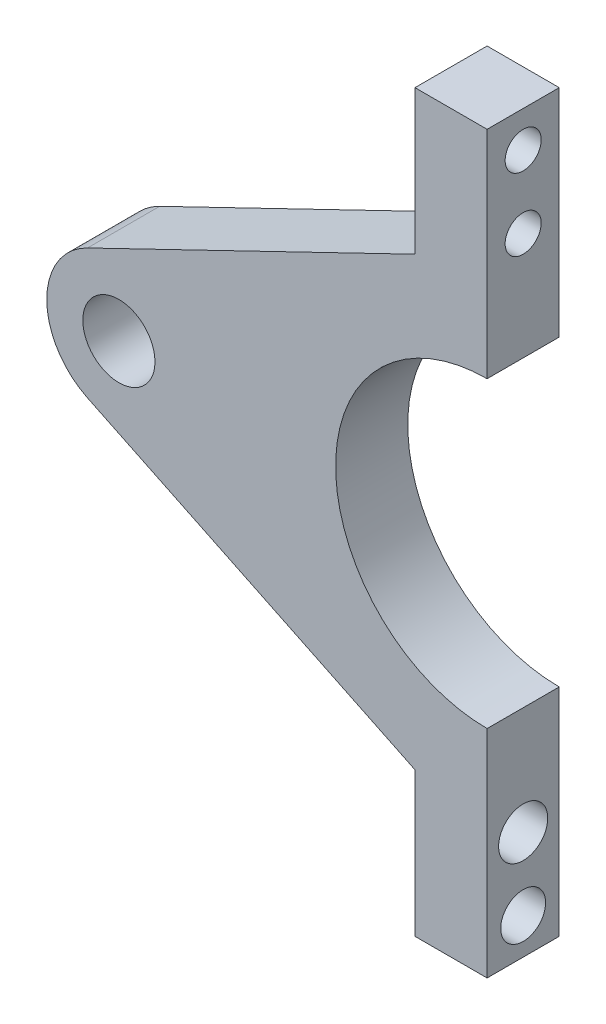
ISO-10303-21;
HEADER;
FILE_DESCRIPTION(('STEP AP214'),'2;1');
FILE_NAME('part.step','',(''),(''),'','','');
FILE_SCHEMA(('AUTOMOTIVE_DESIGN { 1 0 10303 214 1 1 1 1 }'));
ENDSEC;
DATA;
#1=APPLICATION_CONTEXT('core data for automotive mechanical design processes');
#2=APPLICATION_PROTOCOL_DEFINITION('international standard','automotive_design',2000,#1);
#3=PRODUCT_CONTEXT('',#1,'mechanical');
#4=PRODUCT('Part','Part','',(#3));
#5=PRODUCT_RELATED_PRODUCT_CATEGORY('part','',(#4));
#6=PRODUCT_DEFINITION_FORMATION('','',#4);
#7=PRODUCT_DEFINITION_CONTEXT('part definition',#1,'design');
#8=PRODUCT_DEFINITION('design','',#6,#7);
#9=PRODUCT_DEFINITION_SHAPE('','',#8);
#10=(LENGTH_UNIT() NAMED_UNIT(*) SI_UNIT(.MILLI.,.METRE.));
#11=(NAMED_UNIT(*) PLANE_ANGLE_UNIT() SI_UNIT($,.RADIAN.));
#12=(NAMED_UNIT(*) SI_UNIT($,.STERADIAN.) SOLID_ANGLE_UNIT());
#13=UNCERTAINTY_MEASURE_WITH_UNIT(LENGTH_MEASURE(1.E-05),#10,'distance_accuracy_value','');
#14=(GEOMETRIC_REPRESENTATION_CONTEXT(3) GLOBAL_UNCERTAINTY_ASSIGNED_CONTEXT((#13)) GLOBAL_UNIT_ASSIGNED_CONTEXT((#10,
#11,#12)) REPRESENTATION_CONTEXT('',''));
#15=CARTESIAN_POINT('',(0.,0.,0.));
#16=DIRECTION('',(0.,0.,1.));
#17=DIRECTION('',(1.,0.,0.));
#18=AXIS2_PLACEMENT_3D('',#15,#16,#17);
#19=CARTESIAN_POINT('',(-122.095943171356,54.25,-10.));
#20=DIRECTION('',(0.,1.,0.));
#21=DIRECTION('',(-1.,0.,0.));
#22=AXIS2_PLACEMENT_3D('',#19,#20,#21);
#23=PLANE('',#22);
#24=DIRECTION('',(-1.,0.,0.));
#25=VECTOR('',#24,1.);
#26=CARTESIAN_POINT('',(-122.095943171356,54.25,0.));
#27=LINE('',#26,#25);
#28=CARTESIAN_POINT('',(-122.095943171356,54.25,0.));
#29=VERTEX_POINT('',#28);
#30=CARTESIAN_POINT('',(-132.095943171356,54.25,0.));
#31=VERTEX_POINT('',#30);
#32=EDGE_CURVE('E143',#29,#31,#27,.T.);
#33=ORIENTED_EDGE('',*,*,#32,.F.);
#34=DIRECTION('',(0.,0.,1.));
#35=VECTOR('',#34,1.);
#36=CARTESIAN_POINT('',(-122.095943171356,54.25,-10.));
#37=LINE('',#36,#35);
#38=CARTESIAN_POINT('',(-122.095943171356,54.25,-10.));
#39=VERTEX_POINT('',#38);
#40=EDGE_CURVE('E11',#39,#29,#37,.T.);
#41=ORIENTED_EDGE('',*,*,#40,.F.);
#42=DIRECTION('',(-1.,0.,0.));
#43=VECTOR('',#42,1.);
#44=CARTESIAN_POINT('',(-122.095943171356,54.25,-10.));
#45=LINE('',#44,#43);
#46=CARTESIAN_POINT('',(-132.095943171356,54.25,-10.));
#47=VERTEX_POINT('',#46);
#48=EDGE_CURVE('E170',#39,#47,#45,.T.);
#49=ORIENTED_EDGE('',*,*,#48,.T.);
#50=DIRECTION('',(0.,0.,1.));
#51=VECTOR('',#50,1.);
#52=CARTESIAN_POINT('',(-132.095943171356,54.25,-10.));
#53=LINE('',#52,#51);
#54=EDGE_CURVE('E95',#47,#31,#53,.T.);
#55=ORIENTED_EDGE('',*,*,#54,.T.);
#56=EDGE_LOOP('',(#33,#41,#49,#55));
#57=FACE_BOUND('',#56,.T.);
#58=ADVANCED_FACE('F33',(#57),#23,.T.);
#59=CARTESIAN_POINT('',(-122.095943171356,24.2996794871795,-10.));
#60=DIRECTION('',(1.,0.,0.));
#61=DIRECTION('',(0.,0.,-1.));
#62=AXIS2_PLACEMENT_3D('',#59,#60,#61);
#63=PLANE('',#62);
#64=CARTESIAN_POINT('',(-122.095943171356,49.25,-5.));
#65=DIRECTION('',(1.,0.,0.));
#66=DIRECTION('',(0.,0.,-1.));
#67=AXIS2_PLACEMENT_3D('',#64,#65,#66);
#68=CIRCLE('',#67,2.5);
#69=CARTESIAN_POINT('',(-122.095943171356,49.25,-7.5));
#70=VERTEX_POINT('',#69);
#71=EDGE_CURVE('E189',#70,#70,#68,.T.);
#72=ORIENTED_EDGE('',*,*,#71,.F.);
#73=EDGE_LOOP('',(#72));
#74=FACE_BOUND('',#73,.T.);
#75=CARTESIAN_POINT('',(-122.095943171356,39.25,-5.));
#76=DIRECTION('',(1.,0.,0.));
#77=DIRECTION('',(0.,0.,-1.));
#78=AXIS2_PLACEMENT_3D('',#75,#76,#77);
#79=CIRCLE('',#78,2.5);
#80=CARTESIAN_POINT('',(-122.095943171356,39.25,-7.5));
#81=VERTEX_POINT('',#80);
#82=EDGE_CURVE('E286',#81,#81,#79,.T.);
#83=ORIENTED_EDGE('',*,*,#82,.F.);
#84=EDGE_LOOP('',(#83));
#85=FACE_BOUND('',#84,.T.);
#86=DIRECTION('',(0.,1.,0.));
#87=VECTOR('',#86,1.);
#88=CARTESIAN_POINT('',(-122.095943171356,24.2996794871795,0.));
#89=LINE('',#88,#87);
#90=CARTESIAN_POINT('',(-122.095943171356,24.2996794871795,0.));
#91=VERTEX_POINT('',#90);
#92=EDGE_CURVE('E168',#91,#29,#89,.T.);
#93=ORIENTED_EDGE('',*,*,#92,.F.);
#94=DIRECTION('',(0.,0.,1.));
#95=VECTOR('',#94,1.);
#96=CARTESIAN_POINT('',(-122.095943171356,24.2996794871795,-10.));
#97=LINE('',#96,#95);
#98=CARTESIAN_POINT('',(-122.095943171356,24.2996794871795,-10.));
#99=VERTEX_POINT('',#98);
#100=EDGE_CURVE('E42',#99,#91,#97,.T.);
#101=ORIENTED_EDGE('',*,*,#100,.F.);
#102=DIRECTION('',(0.,1.,0.));
#103=VECTOR('',#102,1.);
#104=CARTESIAN_POINT('',(-122.095943171356,24.2996794871795,-10.));
#105=LINE('',#104,#103);
#106=EDGE_CURVE('E133',#99,#39,#105,.T.);
#107=ORIENTED_EDGE('',*,*,#106,.T.);
#108=ORIENTED_EDGE('',*,*,#40,.T.);
#109=EDGE_LOOP('',(#93,#101,#107,#108));
#110=FACE_BOUND('',#109,.T.);
#111=ADVANCED_FACE('F239',(#74,#85,#110),#63,.T.);
#112=CARTESIAN_POINT('',(-122.095943171356,3.2996794871795,-10.));
#113=DIRECTION('',(0.,0.,1.));
#114=DIRECTION('',(1.,0.,0.));
#115=AXIS2_PLACEMENT_3D('',#112,#113,#114);
#116=CYLINDRICAL_SURFACE('',#115,21.);
#117=CARTESIAN_POINT('',(-122.095943171356,3.2996794871795,0.));
#118=DIRECTION('',(0.,0.,-1.));
#119=DIRECTION('',(1.,0.,0.));
#120=AXIS2_PLACEMENT_3D('',#117,#118,#119);
#121=CIRCLE('',#120,21.);
#122=CARTESIAN_POINT('',(-122.095943171356,-17.7003205128205,0.));
#123=VERTEX_POINT('',#122);
#124=EDGE_CURVE('E120',#123,#91,#121,.T.);
#125=ORIENTED_EDGE('',*,*,#124,.F.);
#126=DIRECTION('',(0.,0.,1.));
#127=VECTOR('',#126,1.);
#128=CARTESIAN_POINT('',(-122.095943171356,-17.7003205128205,-10.));
#129=LINE('',#128,#127);
#130=CARTESIAN_POINT('',(-122.095943171356,-17.7003205128205,-10.));
#131=VERTEX_POINT('',#130);
#132=EDGE_CURVE('E115',#131,#123,#129,.T.);
#133=ORIENTED_EDGE('',*,*,#132,.F.);
#134=CARTESIAN_POINT('',(-122.095943171356,3.2996794871795,-10.));
#135=DIRECTION('',(0.,0.,-1.));
#136=DIRECTION('',(1.,0.,0.));
#137=AXIS2_PLACEMENT_3D('',#134,#135,#136);
#138=CIRCLE('',#137,21.);
#139=EDGE_CURVE('E118',#131,#99,#138,.T.);
#140=ORIENTED_EDGE('',*,*,#139,.T.);
#141=ORIENTED_EDGE('',*,*,#100,.T.);
#142=EDGE_LOOP('',(#125,#133,#140,#141));
#143=FACE_BOUND('',#142,.T.);
#144=ADVANCED_FACE('F117',(#143),#116,.F.);
#145=CARTESIAN_POINT('',(-122.095943171356,-17.7003205128205,-10.));
#146=DIRECTION('',(1.,0.,0.));
#147=DIRECTION('',(0.,0.,-1.));
#148=AXIS2_PLACEMENT_3D('',#145,#146,#147);
#149=PLANE('',#148);
#150=CARTESIAN_POINT('',(-122.095943171356,-32.650641025641,-5.));
#151=DIRECTION('',(1.,0.,0.));
#152=DIRECTION('',(0.,0.,-1.));
#153=AXIS2_PLACEMENT_3D('',#150,#151,#152);
#154=CIRCLE('',#153,3.40660528350679);
#155=CARTESIAN_POINT('',(-122.095943171356,-32.650641025641,-8.40660528350679));
#156=VERTEX_POINT('',#155);
#157=EDGE_CURVE('E292',#156,#156,#154,.T.);
#158=ORIENTED_EDGE('',*,*,#157,.F.);
#159=EDGE_LOOP('',(#158));
#160=FACE_BOUND('',#159,.T.);
#161=CARTESIAN_POINT('',(-122.095943171356,-42.650641025641,-5.));
#162=DIRECTION('',(1.,0.,0.));
#163=DIRECTION('',(0.,0.,-1.));
#164=AXIS2_PLACEMENT_3D('',#161,#162,#163);
#165=CIRCLE('',#164,3.11258651927146);
#166=CARTESIAN_POINT('',(-122.095943171356,-42.650641025641,-8.11258651927146));
#167=VERTEX_POINT('',#166);
#168=EDGE_CURVE('E287',#167,#167,#165,.T.);
#169=ORIENTED_EDGE('',*,*,#168,.F.);
#170=EDGE_LOOP('',(#169));
#171=FACE_BOUND('',#170,.T.);
#172=DIRECTION('',(0.,1.,0.));
#173=VECTOR('',#172,1.);
#174=CARTESIAN_POINT('',(-122.095943171356,-17.7003205128205,0.));
#175=LINE('',#174,#173);
#176=CARTESIAN_POINT('',(-122.095943171356,-47.650641025641,0.));
#177=VERTEX_POINT('',#176);
#178=EDGE_CURVE('E165',#177,#123,#175,.T.);
#179=ORIENTED_EDGE('',*,*,#178,.F.);
#180=DIRECTION('',(0.,0.,1.));
#181=VECTOR('',#180,1.);
#182=CARTESIAN_POINT('',(-122.095943171356,-47.650641025641,-10.));
#183=LINE('',#182,#181);
#184=CARTESIAN_POINT('',(-122.095943171356,-47.650641025641,-10.));
#185=VERTEX_POINT('',#184);
#186=EDGE_CURVE('E125',#185,#177,#183,.T.);
#187=ORIENTED_EDGE('',*,*,#186,.F.);
#188=DIRECTION('',(0.,1.,0.));
#189=VECTOR('',#188,1.);
#190=CARTESIAN_POINT('',(-122.095943171356,-17.7003205128205,-10.));
#191=LINE('',#190,#189);
#192=EDGE_CURVE('E131',#185,#131,#191,.T.);
#193=ORIENTED_EDGE('',*,*,#192,.T.);
#194=ORIENTED_EDGE('',*,*,#132,.T.);
#195=EDGE_LOOP('',(#179,#187,#193,#194));
#196=FACE_BOUND('',#195,.T.);
#197=ADVANCED_FACE('F135',(#160,#171,#196),#149,.T.);
#198=CARTESIAN_POINT('',(-122.095943171356,-47.650641025641,-10.));
#199=DIRECTION('',(0.,-1.,0.));
#200=DIRECTION('',(1.,0.,0.));
#201=AXIS2_PLACEMENT_3D('',#198,#199,#200);
#202=PLANE('',#201);
#203=DIRECTION('',(1.,0.,0.));
#204=VECTOR('',#203,1.);
#205=CARTESIAN_POINT('',(-122.095943171356,-47.650641025641,0.));
#206=LINE('',#205,#204);
#207=CARTESIAN_POINT('',(-132.095943171356,-47.650641025641,0.));
#208=VERTEX_POINT('',#207);
#209=EDGE_CURVE('E162',#208,#177,#206,.T.);
#210=ORIENTED_EDGE('',*,*,#209,.F.);
#211=DIRECTION('',(0.,0.,1.));
#212=VECTOR('',#211,1.);
#213=CARTESIAN_POINT('',(-132.095943171356,-47.650641025641,-10.));
#214=LINE('',#213,#212);
#215=CARTESIAN_POINT('',(-132.095943171356,-47.650641025641,-10.));
#216=VERTEX_POINT('',#215);
#217=EDGE_CURVE('E174',#216,#208,#214,.T.);
#218=ORIENTED_EDGE('',*,*,#217,.F.);
#219=DIRECTION('',(1.,0.,0.));
#220=VECTOR('',#219,1.);
#221=CARTESIAN_POINT('',(-122.095943171356,-47.650641025641,-10.));
#222=LINE('',#221,#220);
#223=EDGE_CURVE('E136',#216,#185,#222,.T.);
#224=ORIENTED_EDGE('',*,*,#223,.T.);
#225=ORIENTED_EDGE('',*,*,#186,.T.);
#226=EDGE_LOOP('',(#210,#218,#224,#225));
#227=FACE_BOUND('',#226,.T.);
#228=ADVANCED_FACE('F255',(#227),#202,.T.);
#229=CARTESIAN_POINT('',(-132.095943171356,-47.650641025641,-10.));
#230=DIRECTION('',(-1.,0.,0.));
#231=DIRECTION('',(0.,0.,1.));
#232=AXIS2_PLACEMENT_3D('',#229,#230,#231);
#233=PLANE('',#232);
#234=CARTESIAN_POINT('',(-132.095943171356,-32.650641025641,-5.));
#235=DIRECTION('',(-1.,0.,0.));
#236=DIRECTION('',(0.,0.,1.));
#237=AXIS2_PLACEMENT_3D('',#234,#235,#236);
#238=CIRCLE('',#237,3.40660528350679);
#239=CARTESIAN_POINT('',(-132.095943171356,-32.650641025641,-8.40660528350679));
#240=VERTEX_POINT('',#239);
#241=EDGE_CURVE('E36',#240,#240,#238,.T.);
#242=ORIENTED_EDGE('',*,*,#241,.F.);
#243=EDGE_LOOP('',(#242));
#244=FACE_BOUND('',#243,.T.);
#245=CARTESIAN_POINT('',(-132.095943171356,-42.650641025641,-5.));
#246=DIRECTION('',(-1.,0.,0.));
#247=DIRECTION('',(0.,0.,1.));
#248=AXIS2_PLACEMENT_3D('',#245,#246,#247);
#249=CIRCLE('',#248,3.11258651927146);
#250=CARTESIAN_POINT('',(-132.095943171356,-42.650641025641,-8.11258651927146));
#251=VERTEX_POINT('',#250);
#252=EDGE_CURVE('E191',#251,#251,#249,.T.);
#253=ORIENTED_EDGE('',*,*,#252,.F.);
#254=EDGE_LOOP('',(#253));
#255=FACE_BOUND('',#254,.T.);
#256=DIRECTION('',(0.,-1.,0.));
#257=VECTOR('',#256,1.);
#258=CARTESIAN_POINT('',(-132.095943171356,-47.650641025641,0.));
#259=LINE('',#258,#257);
#260=CARTESIAN_POINT('',(-132.095943171356,-27.6506410256411,0.));
#261=VERTEX_POINT('',#260);
#262=EDGE_CURVE('E159',#261,#208,#259,.T.);
#263=ORIENTED_EDGE('',*,*,#262,.F.);
#264=DIRECTION('',(0.,0.,1.));
#265=VECTOR('',#264,1.);
#266=CARTESIAN_POINT('',(-132.095943171356,-27.6506410256411,-10.));
#267=LINE('',#266,#265);
#268=CARTESIAN_POINT('',(-132.095943171356,-27.6506410256411,-10.));
#269=VERTEX_POINT('',#268);
#270=EDGE_CURVE('E176',#269,#261,#267,.T.);
#271=ORIENTED_EDGE('',*,*,#270,.F.);
#272=DIRECTION('',(0.,-1.,0.));
#273=VECTOR('',#272,1.);
#274=CARTESIAN_POINT('',(-132.095943171356,-47.650641025641,-10.));
#275=LINE('',#274,#273);
#276=EDGE_CURVE('E138',#269,#216,#275,.T.);
#277=ORIENTED_EDGE('',*,*,#276,.T.);
#278=ORIENTED_EDGE('',*,*,#217,.T.);
#279=EDGE_LOOP('',(#263,#271,#277,#278));
#280=FACE_BOUND('',#279,.T.);
#281=ADVANCED_FACE('F222',(#244,#255,#280),#233,.T.);
#282=CARTESIAN_POINT('',(-132.095943171356,-27.6506410256411,-10.));
#283=DIRECTION('',(-0.435227541755654,-0.900320491212619,0.));
#284=DIRECTION('',(0.900320491212619,-0.435227541755654,0.));
#285=AXIS2_PLACEMENT_3D('',#282,#283,#284);
#286=PLANE('',#285);
#287=DIRECTION('',(0.900320491212619,-0.435227541755654,0.));
#288=VECTOR('',#287,1.);
#289=CARTESIAN_POINT('',(-132.095943171356,-27.6506410256411,0.));
#290=LINE('',#289,#288);
#291=CARTESIAN_POINT('',(-177.496190174591,-5.70352542494669,0.));
#292=VERTEX_POINT('',#291);
#293=EDGE_CURVE('E156',#292,#261,#290,.T.);
#294=ORIENTED_EDGE('',*,*,#293,.F.);
#295=DIRECTION('',(0.,0.,1.));
#296=VECTOR('',#295,1.);
#297=CARTESIAN_POINT('',(-177.496190174591,-5.70352542494669,-10.));
#298=LINE('',#297,#296);
#299=CARTESIAN_POINT('',(-177.496190174591,-5.70352542494669,-10.));
#300=VERTEX_POINT('',#299);
#301=EDGE_CURVE('E178',#300,#292,#298,.T.);
#302=ORIENTED_EDGE('',*,*,#301,.F.);
#303=DIRECTION('',(0.900320491212619,-0.435227541755654,0.));
#304=VECTOR('',#303,1.);
#305=CARTESIAN_POINT('',(-132.095943171356,-27.6506410256411,-10.));
#306=LINE('',#305,#304);
#307=EDGE_CURVE('E216',#300,#269,#306,.T.);
#308=ORIENTED_EDGE('',*,*,#307,.T.);
#309=ORIENTED_EDGE('',*,*,#270,.T.);
#310=EDGE_LOOP('',(#294,#302,#308,#309));
#311=FACE_BOUND('',#310,.T.);
#312=ADVANCED_FACE('F228',(#311),#286,.T.);
#313=CARTESIAN_POINT('',(-173.143914757034,3.29967948717946,-10.));
#314=DIRECTION('',(0.,0.,1.));
#315=DIRECTION('',(1.,0.,0.));
#316=AXIS2_PLACEMENT_3D('',#313,#314,#315);
#317=CYLINDRICAL_SURFACE('',#316,9.99999999999996);
#318=CARTESIAN_POINT('',(-173.143914757034,3.29967948717946,0.));
#319=DIRECTION('',(0.,0.,1.));
#320=DIRECTION('',(1.,0.,0.));
#321=AXIS2_PLACEMENT_3D('',#318,#319,#320);
#322=CIRCLE('',#321,9.99999999999996);
#323=CARTESIAN_POINT('',(-177.496190174591,12.3028843993056,0.));
#324=VERTEX_POINT('',#323);
#325=EDGE_CURVE('E153',#324,#292,#322,.T.);
#326=ORIENTED_EDGE('',*,*,#325,.F.);
#327=DIRECTION('',(0.,0.,1.));
#328=VECTOR('',#327,1.);
#329=CARTESIAN_POINT('',(-177.496190174591,12.3028843993056,-10.));
#330=LINE('',#329,#328);
#331=CARTESIAN_POINT('',(-177.496190174591,12.3028843993056,-10.));
#332=VERTEX_POINT('',#331);
#333=EDGE_CURVE('E180',#332,#324,#330,.T.);
#334=ORIENTED_EDGE('',*,*,#333,.F.);
#335=CARTESIAN_POINT('',(-173.143914757034,3.29967948717946,-10.));
#336=DIRECTION('',(0.,0.,1.));
#337=DIRECTION('',(1.,0.,0.));
#338=AXIS2_PLACEMENT_3D('',#335,#336,#337);
#339=CIRCLE('',#338,9.99999999999996);
#340=EDGE_CURVE('E213',#332,#300,#339,.T.);
#341=ORIENTED_EDGE('',*,*,#340,.T.);
#342=ORIENTED_EDGE('',*,*,#301,.T.);
#343=EDGE_LOOP('',(#326,#334,#341,#342));
#344=FACE_BOUND('',#343,.T.);
#345=ADVANCED_FACE('F231',(#344),#317,.T.);
#346=CARTESIAN_POINT('',(-132.095943171356,34.25,-10.));
#347=DIRECTION('',(-0.435227541755654,0.900320491212618,0.));
#348=DIRECTION('',(-0.900320491212618,-0.435227541755654,0.));
#349=AXIS2_PLACEMENT_3D('',#346,#347,#348);
#350=PLANE('',#349);
#351=DIRECTION('',(-0.900320491212618,-0.435227541755654,0.));
#352=VECTOR('',#351,1.);
#353=CARTESIAN_POINT('',(-132.095943171356,34.25,0.));
#354=LINE('',#353,#352);
#355=CARTESIAN_POINT('',(-132.095943171356,34.25,0.));
#356=VERTEX_POINT('',#355);
#357=EDGE_CURVE('E150',#356,#324,#354,.T.);
#358=ORIENTED_EDGE('',*,*,#357,.F.);
#359=DIRECTION('',(0.,0.,1.));
#360=VECTOR('',#359,1.);
#361=CARTESIAN_POINT('',(-132.095943171356,34.25,-10.));
#362=LINE('',#361,#360);
#363=CARTESIAN_POINT('',(-132.095943171356,34.25,-10.));
#364=VERTEX_POINT('',#363);
#365=EDGE_CURVE('E182',#364,#356,#362,.T.);
#366=ORIENTED_EDGE('',*,*,#365,.F.);
#367=DIRECTION('',(-0.900320491212618,-0.435227541755654,0.));
#368=VECTOR('',#367,1.);
#369=CARTESIAN_POINT('',(-132.095943171356,34.25,-10.));
#370=LINE('',#369,#368);
#371=EDGE_CURVE('E210',#364,#332,#370,.T.);
#372=ORIENTED_EDGE('',*,*,#371,.T.);
#373=ORIENTED_EDGE('',*,*,#333,.T.);
#374=EDGE_LOOP('',(#358,#366,#372,#373));
#375=FACE_BOUND('',#374,.T.);
#376=ADVANCED_FACE('F235',(#375),#350,.T.);
#377=CARTESIAN_POINT('',(-132.095943171356,54.25,-10.));
#378=DIRECTION('',(-1.,0.,0.));
#379=DIRECTION('',(0.,0.,1.));
#380=AXIS2_PLACEMENT_3D('',#377,#378,#379);
#381=PLANE('',#380);
#382=CARTESIAN_POINT('',(-132.095943171356,49.25,-5.));
#383=DIRECTION('',(-1.,0.,0.));
#384=DIRECTION('',(0.,0.,1.));
#385=AXIS2_PLACEMENT_3D('',#382,#383,#384);
#386=CIRCLE('',#385,2.5);
#387=CARTESIAN_POINT('',(-132.095943171356,49.25,-7.5));
#388=VERTEX_POINT('',#387);
#389=EDGE_CURVE('E188',#388,#388,#386,.T.);
#390=ORIENTED_EDGE('',*,*,#389,.F.);
#391=EDGE_LOOP('',(#390));
#392=FACE_BOUND('',#391,.T.);
#393=CARTESIAN_POINT('',(-132.095943171356,39.25,-5.));
#394=DIRECTION('',(-1.,0.,0.));
#395=DIRECTION('',(0.,0.,1.));
#396=AXIS2_PLACEMENT_3D('',#393,#394,#395);
#397=CIRCLE('',#396,2.5);
#398=CARTESIAN_POINT('',(-132.095943171356,39.25,-7.5));
#399=VERTEX_POINT('',#398);
#400=EDGE_CURVE('E185',#399,#399,#397,.T.);
#401=ORIENTED_EDGE('',*,*,#400,.F.);
#402=EDGE_LOOP('',(#401));
#403=FACE_BOUND('',#402,.T.);
#404=DIRECTION('',(0.,-1.,0.));
#405=VECTOR('',#404,1.);
#406=CARTESIAN_POINT('',(-132.095943171356,54.25,0.));
#407=LINE('',#406,#405);
#408=EDGE_CURVE('E146',#31,#356,#407,.T.);
#409=ORIENTED_EDGE('',*,*,#408,.F.);
#410=ORIENTED_EDGE('',*,*,#54,.F.);
#411=DIRECTION('',(0.,-1.,0.));
#412=VECTOR('',#411,1.);
#413=CARTESIAN_POINT('',(-132.095943171356,54.25,-10.));
#414=LINE('',#413,#412);
#415=EDGE_CURVE('E208',#47,#364,#414,.T.);
#416=ORIENTED_EDGE('',*,*,#415,.T.);
#417=ORIENTED_EDGE('',*,*,#365,.T.);
#418=EDGE_LOOP('',(#409,#410,#416,#417));
#419=FACE_BOUND('',#418,.T.);
#420=ADVANCED_FACE('F236',(#392,#403,#419),#381,.T.);
#421=CARTESIAN_POINT('',(-173.143914757034,3.29967948717946,-10.));
#422=DIRECTION('',(0.,0.,1.));
#423=DIRECTION('',(1.,0.,0.));
#424=AXIS2_PLACEMENT_3D('',#421,#422,#423);
#425=PLANE('',#424);
#426=CARTESIAN_POINT('',(-173.143914757034,3.29967948717946,-10.));
#427=DIRECTION('',(0.,0.,1.));
#428=DIRECTION('',(1.,0.,0.));
#429=AXIS2_PLACEMENT_3D('',#426,#427,#428);
#430=CIRCLE('',#429,4.99999999999999);
#431=CARTESIAN_POINT('',(-168.143914757034,3.29967948717946,-10.));
#432=VERTEX_POINT('',#431);
#433=EDGE_CURVE('E147',#432,#432,#430,.T.);
#434=ORIENTED_EDGE('',*,*,#433,.T.);
#435=EDGE_LOOP('',(#434));
#436=FACE_BOUND('',#435,.T.);
#437=ORIENTED_EDGE('',*,*,#48,.F.);
#438=ORIENTED_EDGE('',*,*,#106,.F.);
#439=ORIENTED_EDGE('',*,*,#139,.F.);
#440=ORIENTED_EDGE('',*,*,#192,.F.);
#441=ORIENTED_EDGE('',*,*,#223,.F.);
#442=ORIENTED_EDGE('',*,*,#276,.F.);
#443=ORIENTED_EDGE('',*,*,#307,.F.);
#444=ORIENTED_EDGE('',*,*,#340,.F.);
#445=ORIENTED_EDGE('',*,*,#371,.F.);
#446=ORIENTED_EDGE('',*,*,#415,.F.);
#447=EDGE_LOOP('',(#437,#438,#439,#440,#441,#442,#443,#444,#445,#446));
#448=FACE_BOUND('',#447,.T.);
#449=ADVANCED_FACE('F129',(#436,#448),#425,.F.);
#450=CARTESIAN_POINT('',(-173.143914757034,3.29967948717946,0.));
#451=DIRECTION('',(0.,0.,1.));
#452=DIRECTION('',(1.,0.,0.));
#453=AXIS2_PLACEMENT_3D('',#450,#451,#452);
#454=PLANE('',#453);
#455=CARTESIAN_POINT('',(-173.143914757034,3.29967948717946,0.));
#456=DIRECTION('',(0.,0.,1.));
#457=DIRECTION('',(1.,0.,0.));
#458=AXIS2_PLACEMENT_3D('',#455,#456,#457);
#459=CIRCLE('',#458,4.99999999999999);
#460=CARTESIAN_POINT('',(-168.143914757034,3.29967948717946,0.));
#461=VERTEX_POINT('',#460);
#462=EDGE_CURVE('E196',#461,#461,#459,.T.);
#463=ORIENTED_EDGE('',*,*,#462,.F.);
#464=EDGE_LOOP('',(#463));
#465=FACE_BOUND('',#464,.T.);
#466=ORIENTED_EDGE('',*,*,#32,.T.);
#467=ORIENTED_EDGE('',*,*,#408,.T.);
#468=ORIENTED_EDGE('',*,*,#357,.T.);
#469=ORIENTED_EDGE('',*,*,#325,.T.);
#470=ORIENTED_EDGE('',*,*,#293,.T.);
#471=ORIENTED_EDGE('',*,*,#262,.T.);
#472=ORIENTED_EDGE('',*,*,#209,.T.);
#473=ORIENTED_EDGE('',*,*,#178,.T.);
#474=ORIENTED_EDGE('',*,*,#124,.T.);
#475=ORIENTED_EDGE('',*,*,#92,.T.);
#476=EDGE_LOOP('',(#466,#467,#468,#469,#470,#471,#472,#473,#474,#475));
#477=FACE_BOUND('',#476,.T.);
#478=ADVANCED_FACE('F238',(#465,#477),#454,.T.);
#479=CARTESIAN_POINT('',(-173.143914757034,3.29967948717946,-10.));
#480=DIRECTION('',(0.,0.,1.));
#481=DIRECTION('',(1.,0.,0.));
#482=AXIS2_PLACEMENT_3D('',#479,#480,#481);
#483=CYLINDRICAL_SURFACE('',#482,4.99999999999999);
#484=ORIENTED_EDGE('',*,*,#433,.F.);
#485=EDGE_LOOP('',(#484));
#486=FACE_BOUND('',#485,.T.);
#487=ORIENTED_EDGE('',*,*,#462,.T.);
#488=EDGE_LOOP('',(#487));
#489=FACE_BOUND('',#488,.T.);
#490=ADVANCED_FACE('F282',(#486,#489),#483,.F.);
#491=CARTESIAN_POINT('',(-183.143914757034,39.25,-5.));
#492=DIRECTION('',(1.,0.,0.));
#493=DIRECTION('',(0.,0.,-1.));
#494=AXIS2_PLACEMENT_3D('',#491,#492,#493);
#495=CYLINDRICAL_SURFACE('',#494,2.5);
#496=CARTESIAN_POINT('',(-132.095943171356,39.25,-7.5));
#497=CARTESIAN_POINT('',(-131.99177650469,39.25,-7.5));
#498=CARTESIAN_POINT('',(-131.887609838023,39.25,-7.5));
#499=CARTESIAN_POINT('',(-131.67927650469,39.25,-7.5));
#500=CARTESIAN_POINT('',(-131.575109838023,39.25,-7.5));
#501=CARTESIAN_POINT('',(-131.36677650469,39.25,-7.5));
#502=CARTESIAN_POINT('',(-131.262609838023,39.25,-7.5));
#503=CARTESIAN_POINT('',(-131.05427650469,39.25,-7.5));
#504=CARTESIAN_POINT('',(-130.950109838023,39.25,-7.5));
#505=CARTESIAN_POINT('',(-130.74177650469,39.25,-7.5));
#506=CARTESIAN_POINT('',(-130.637609838023,39.25,-7.5));
#507=CARTESIAN_POINT('',(-130.42927650469,39.25,-7.5));
#508=CARTESIAN_POINT('',(-130.325109838023,39.25,-7.5));
#509=CARTESIAN_POINT('',(-130.11677650469,39.25,-7.5));
#510=CARTESIAN_POINT('',(-130.012609838023,39.25,-7.5));
#511=CARTESIAN_POINT('',(-129.80427650469,39.25,-7.5));
#512=CARTESIAN_POINT('',(-129.700109838023,39.25,-7.5));
#513=CARTESIAN_POINT('',(-129.49177650469,39.25,-7.5));
#514=CARTESIAN_POINT('',(-129.387609838023,39.25,-7.5));
#515=CARTESIAN_POINT('',(-129.17927650469,39.25,-7.5));
#516=CARTESIAN_POINT('',(-129.075109838023,39.25,-7.5));
#517=CARTESIAN_POINT('',(-128.86677650469,39.25,-7.5));
#518=CARTESIAN_POINT('',(-128.762609838023,39.25,-7.5));
#519=CARTESIAN_POINT('',(-128.55427650469,39.25,-7.5));
#520=CARTESIAN_POINT('',(-128.450109838023,39.25,-7.5));
#521=CARTESIAN_POINT('',(-128.24177650469,39.25,-7.5));
#522=CARTESIAN_POINT('',(-128.137609838023,39.25,-7.5));
#523=CARTESIAN_POINT('',(-127.92927650469,39.25,-7.5));
#524=CARTESIAN_POINT('',(-127.825109838023,39.25,-7.5));
#525=CARTESIAN_POINT('',(-127.61677650469,39.25,-7.5));
#526=CARTESIAN_POINT('',(-127.512609838023,39.25,-7.5));
#527=CARTESIAN_POINT('',(-127.30427650469,39.25,-7.5));
#528=CARTESIAN_POINT('',(-127.200109838023,39.25,-7.5));
#529=CARTESIAN_POINT('',(-126.99177650469,39.25,-7.5));
#530=CARTESIAN_POINT('',(-126.887609838023,39.25,-7.5));
#531=CARTESIAN_POINT('',(-126.67927650469,39.25,-7.5));
#532=CARTESIAN_POINT('',(-126.575109838023,39.25,-7.5));
#533=CARTESIAN_POINT('',(-126.36677650469,39.25,-7.5));
#534=CARTESIAN_POINT('',(-126.262609838023,39.25,-7.5));
#535=CARTESIAN_POINT('',(-126.05427650469,39.25,-7.5));
#536=CARTESIAN_POINT('',(-125.950109838023,39.25,-7.5));
#537=CARTESIAN_POINT('',(-125.74177650469,39.25,-7.5));
#538=CARTESIAN_POINT('',(-125.637609838023,39.25,-7.5));
#539=CARTESIAN_POINT('',(-125.42927650469,39.25,-7.5));
#540=CARTESIAN_POINT('',(-125.325109838023,39.25,-7.5));
#541=CARTESIAN_POINT('',(-125.11677650469,39.25,-7.5));
#542=CARTESIAN_POINT('',(-125.012609838023,39.25,-7.5));
#543=CARTESIAN_POINT('',(-124.80427650469,39.25,-7.5));
#544=CARTESIAN_POINT('',(-124.700109838023,39.25,-7.5));
#545=CARTESIAN_POINT('',(-124.49177650469,39.25,-7.5));
#546=CARTESIAN_POINT('',(-124.387609838023,39.25,-7.5));
#547=CARTESIAN_POINT('',(-124.17927650469,39.25,-7.5));
#548=CARTESIAN_POINT('',(-124.075109838023,39.25,-7.5));
#549=CARTESIAN_POINT('',(-123.86677650469,39.25,-7.5));
#550=CARTESIAN_POINT('',(-123.762609838023,39.25,-7.5));
#551=CARTESIAN_POINT('',(-123.55427650469,39.25,-7.5));
#552=CARTESIAN_POINT('',(-123.450109838023,39.25,-7.5));
#553=CARTESIAN_POINT('',(-123.24177650469,39.25,-7.5));
#554=CARTESIAN_POINT('',(-123.137609838023,39.25,-7.5));
#555=CARTESIAN_POINT('',(-122.92927650469,39.25,-7.5));
#556=CARTESIAN_POINT('',(-122.825109838023,39.25,-7.5));
#557=CARTESIAN_POINT('',(-122.61677650469,39.25,-7.5));
#558=CARTESIAN_POINT('',(-122.512609838023,39.25,-7.5));
#559=CARTESIAN_POINT('',(-122.30427650469,39.25,-7.5));
#560=CARTESIAN_POINT('',(-122.200109838023,39.25,-7.5));
#561=CARTESIAN_POINT('',(-122.095943171356,39.25,-7.5));
#562=B_SPLINE_CURVE_WITH_KNOTS('',3,(#496,#497,#498,#499,#500,#501,#502,#503,#504,#505,#506,
#507,#508,#509,#510,#511,#512,#513,#514,#515,#516,#517,#518,#519,#520,#521,#522,#523,#524,#525,
#526,#527,#528,#529,#530,#531,#532,#533,#534,#535,#536,#537,#538,#539,#540,#541,#542,#543,#544,
#545,#546,#547,#548,#549,#550,#551,#552,#553,#554,#555,#556,#557,#558,#559,#560,#561),
.UNSPECIFIED.,.F.,.F.,(4,2,2,2,2,2,2,2,2,2,2,2,2,2,2,2,2,2,2,2,2,2,2,2,2,2,2,2,2,2,2,2,4),(0.,
0.312500000000021,0.625000000000014,0.937500000000008,1.25,1.56249999999999,1.87499999999999,
2.18750000000001,2.5,2.8125,3.12500000000002,3.43750000000001,3.75,4.0625,4.37499999999999,
4.68749999999998,5.,5.3125,5.62499999999999,5.93750000000001,6.25000000000001,6.5625,
6.87499999999999,7.18749999999999,7.49999999999999,7.8125,8.12499999999999,8.43749999999999,
8.74999999999998,9.0625,9.37499999999999,9.68749999999999,9.99999999999998),.UNSPECIFIED.);
#563=EDGE_CURVE('BSEAM278',#399,#81,#562,.T.);
#564=ORIENTED_EDGE('',*,*,#400,.T.);
#565=ORIENTED_EDGE('',*,*,#82,.T.);
#566=ORIENTED_EDGE('',*,*,#563,.T.);
#567=ORIENTED_EDGE('',*,*,#563,.F.);
#568=EDGE_LOOP('',(#564,#566,#565,#567));
#569=FACE_BOUND('',#568,.T.);
#570=ADVANCED_FACE('F278',(#569),#495,.F.);
#571=CARTESIAN_POINT('',(-183.143914757034,49.25,-5.));
#572=DIRECTION('',(1.,0.,0.));
#573=DIRECTION('',(0.,0.,-1.));
#574=AXIS2_PLACEMENT_3D('',#571,#572,#573);
#575=CYLINDRICAL_SURFACE('',#574,2.5);
#576=CARTESIAN_POINT('',(-132.095943171356,49.25,-7.5));
#577=CARTESIAN_POINT('',(-131.99177650469,49.25,-7.5));
#578=CARTESIAN_POINT('',(-131.887609838023,49.25,-7.5));
#579=CARTESIAN_POINT('',(-131.67927650469,49.25,-7.5));
#580=CARTESIAN_POINT('',(-131.575109838023,49.25,-7.5));
#581=CARTESIAN_POINT('',(-131.36677650469,49.25,-7.5));
#582=CARTESIAN_POINT('',(-131.262609838023,49.25,-7.5));
#583=CARTESIAN_POINT('',(-131.05427650469,49.25,-7.5));
#584=CARTESIAN_POINT('',(-130.950109838023,49.25,-7.5));
#585=CARTESIAN_POINT('',(-130.74177650469,49.25,-7.5));
#586=CARTESIAN_POINT('',(-130.637609838023,49.25,-7.5));
#587=CARTESIAN_POINT('',(-130.42927650469,49.25,-7.5));
#588=CARTESIAN_POINT('',(-130.325109838023,49.25,-7.5));
#589=CARTESIAN_POINT('',(-130.11677650469,49.25,-7.5));
#590=CARTESIAN_POINT('',(-130.012609838023,49.25,-7.5));
#591=CARTESIAN_POINT('',(-129.80427650469,49.25,-7.5));
#592=CARTESIAN_POINT('',(-129.700109838023,49.25,-7.5));
#593=CARTESIAN_POINT('',(-129.49177650469,49.25,-7.5));
#594=CARTESIAN_POINT('',(-129.387609838023,49.25,-7.5));
#595=CARTESIAN_POINT('',(-129.17927650469,49.25,-7.5));
#596=CARTESIAN_POINT('',(-129.075109838023,49.25,-7.5));
#597=CARTESIAN_POINT('',(-128.86677650469,49.25,-7.5));
#598=CARTESIAN_POINT('',(-128.762609838023,49.25,-7.5));
#599=CARTESIAN_POINT('',(-128.55427650469,49.25,-7.5));
#600=CARTESIAN_POINT('',(-128.450109838023,49.25,-7.5));
#601=CARTESIAN_POINT('',(-128.24177650469,49.25,-7.5));
#602=CARTESIAN_POINT('',(-128.137609838023,49.25,-7.5));
#603=CARTESIAN_POINT('',(-127.92927650469,49.25,-7.5));
#604=CARTESIAN_POINT('',(-127.825109838023,49.25,-7.5));
#605=CARTESIAN_POINT('',(-127.61677650469,49.25,-7.5));
#606=CARTESIAN_POINT('',(-127.512609838023,49.25,-7.5));
#607=CARTESIAN_POINT('',(-127.30427650469,49.25,-7.5));
#608=CARTESIAN_POINT('',(-127.200109838023,49.25,-7.5));
#609=CARTESIAN_POINT('',(-126.99177650469,49.25,-7.5));
#610=CARTESIAN_POINT('',(-126.887609838023,49.25,-7.5));
#611=CARTESIAN_POINT('',(-126.67927650469,49.25,-7.5));
#612=CARTESIAN_POINT('',(-126.575109838023,49.25,-7.5));
#613=CARTESIAN_POINT('',(-126.36677650469,49.25,-7.5));
#614=CARTESIAN_POINT('',(-126.262609838023,49.25,-7.5));
#615=CARTESIAN_POINT('',(-126.05427650469,49.25,-7.5));
#616=CARTESIAN_POINT('',(-125.950109838023,49.25,-7.5));
#617=CARTESIAN_POINT('',(-125.74177650469,49.25,-7.5));
#618=CARTESIAN_POINT('',(-125.637609838023,49.25,-7.5));
#619=CARTESIAN_POINT('',(-125.42927650469,49.25,-7.5));
#620=CARTESIAN_POINT('',(-125.325109838023,49.25,-7.5));
#621=CARTESIAN_POINT('',(-125.11677650469,49.25,-7.5));
#622=CARTESIAN_POINT('',(-125.012609838023,49.25,-7.5));
#623=CARTESIAN_POINT('',(-124.80427650469,49.25,-7.5));
#624=CARTESIAN_POINT('',(-124.700109838023,49.25,-7.5));
#625=CARTESIAN_POINT('',(-124.49177650469,49.25,-7.5));
#626=CARTESIAN_POINT('',(-124.387609838023,49.25,-7.5));
#627=CARTESIAN_POINT('',(-124.17927650469,49.25,-7.5));
#628=CARTESIAN_POINT('',(-124.075109838023,49.25,-7.5));
#629=CARTESIAN_POINT('',(-123.86677650469,49.25,-7.5));
#630=CARTESIAN_POINT('',(-123.762609838023,49.25,-7.5));
#631=CARTESIAN_POINT('',(-123.55427650469,49.25,-7.5));
#632=CARTESIAN_POINT('',(-123.450109838023,49.25,-7.5));
#633=CARTESIAN_POINT('',(-123.24177650469,49.25,-7.5));
#634=CARTESIAN_POINT('',(-123.137609838023,49.25,-7.5));
#635=CARTESIAN_POINT('',(-122.92927650469,49.25,-7.5));
#636=CARTESIAN_POINT('',(-122.825109838023,49.25,-7.5));
#637=CARTESIAN_POINT('',(-122.61677650469,49.25,-7.5));
#638=CARTESIAN_POINT('',(-122.512609838023,49.25,-7.5));
#639=CARTESIAN_POINT('',(-122.30427650469,49.25,-7.5));
#640=CARTESIAN_POINT('',(-122.200109838023,49.25,-7.5));
#641=CARTESIAN_POINT('',(-122.095943171356,49.25,-7.5));
#642=B_SPLINE_CURVE_WITH_KNOTS('',3,(#576,#577,#578,#579,#580,#581,#582,#583,#584,#585,#586,
#587,#588,#589,#590,#591,#592,#593,#594,#595,#596,#597,#598,#599,#600,#601,#602,#603,#604,#605,
#606,#607,#608,#609,#610,#611,#612,#613,#614,#615,#616,#617,#618,#619,#620,#621,#622,#623,#624,
#625,#626,#627,#628,#629,#630,#631,#632,#633,#634,#635,#636,#637,#638,#639,#640,#641),
.UNSPECIFIED.,.F.,.F.,(4,2,2,2,2,2,2,2,2,2,2,2,2,2,2,2,2,2,2,2,2,2,2,2,2,2,2,2,2,2,2,2,4),(0.,
0.312500000000021,0.625000000000014,0.937500000000008,1.25,1.56249999999999,1.87499999999999,
2.18750000000001,2.5,2.8125,3.12500000000002,3.43750000000001,3.75,4.0625,4.37499999999999,
4.68749999999998,5.,5.3125,5.62499999999999,5.93750000000001,6.25000000000001,6.5625,
6.87499999999999,7.18749999999999,7.49999999999999,7.8125,8.12499999999999,8.43749999999999,
8.74999999999998,9.0625,9.37499999999999,9.68749999999999,9.99999999999998),.UNSPECIFIED.);
#643=EDGE_CURVE('BSEAM281',#388,#70,#642,.T.);
#644=ORIENTED_EDGE('',*,*,#389,.T.);
#645=ORIENTED_EDGE('',*,*,#71,.T.);
#646=ORIENTED_EDGE('',*,*,#643,.T.);
#647=ORIENTED_EDGE('',*,*,#643,.F.);
#648=EDGE_LOOP('',(#644,#646,#645,#647));
#649=FACE_BOUND('',#648,.T.);
#650=ADVANCED_FACE('F281',(#649),#575,.F.);
#651=CARTESIAN_POINT('',(-183.143914757034,-42.650641025641,-5.));
#652=DIRECTION('',(1.,0.,0.));
#653=DIRECTION('',(0.,0.,-1.));
#654=AXIS2_PLACEMENT_3D('',#651,#652,#653);
#655=CYLINDRICAL_SURFACE('',#654,3.11258651927146);
#656=CARTESIAN_POINT('',(-132.095943171356,-42.650641025641,-8.11258651927146));
#657=CARTESIAN_POINT('',(-131.99177650469,-42.650641025641,-8.11258651927146));
#658=CARTESIAN_POINT('',(-131.887609838023,-42.650641025641,-8.11258651927146));
#659=CARTESIAN_POINT('',(-131.67927650469,-42.650641025641,-8.11258651927146));
#660=CARTESIAN_POINT('',(-131.575109838023,-42.650641025641,-8.11258651927146));
#661=CARTESIAN_POINT('',(-131.36677650469,-42.650641025641,-8.11258651927146));
#662=CARTESIAN_POINT('',(-131.262609838023,-42.650641025641,-8.11258651927146));
#663=CARTESIAN_POINT('',(-131.05427650469,-42.650641025641,-8.11258651927146));
#664=CARTESIAN_POINT('',(-130.950109838023,-42.650641025641,-8.11258651927146));
#665=CARTESIAN_POINT('',(-130.74177650469,-42.650641025641,-8.11258651927146));
#666=CARTESIAN_POINT('',(-130.637609838023,-42.650641025641,-8.11258651927146));
#667=CARTESIAN_POINT('',(-130.42927650469,-42.650641025641,-8.11258651927146));
#668=CARTESIAN_POINT('',(-130.325109838023,-42.650641025641,-8.11258651927146));
#669=CARTESIAN_POINT('',(-130.11677650469,-42.650641025641,-8.11258651927146));
#670=CARTESIAN_POINT('',(-130.012609838023,-42.650641025641,-8.11258651927146));
#671=CARTESIAN_POINT('',(-129.80427650469,-42.650641025641,-8.11258651927146));
#672=CARTESIAN_POINT('',(-129.700109838023,-42.650641025641,-8.11258651927146));
#673=CARTESIAN_POINT('',(-129.49177650469,-42.650641025641,-8.11258651927146));
#674=CARTESIAN_POINT('',(-129.387609838023,-42.650641025641,-8.11258651927146));
#675=CARTESIAN_POINT('',(-129.17927650469,-42.650641025641,-8.11258651927146));
#676=CARTESIAN_POINT('',(-129.075109838023,-42.650641025641,-8.11258651927146));
#677=CARTESIAN_POINT('',(-128.86677650469,-42.650641025641,-8.11258651927146));
#678=CARTESIAN_POINT('',(-128.762609838023,-42.650641025641,-8.11258651927146));
#679=CARTESIAN_POINT('',(-128.55427650469,-42.650641025641,-8.11258651927146));
#680=CARTESIAN_POINT('',(-128.450109838023,-42.650641025641,-8.11258651927146));
#681=CARTESIAN_POINT('',(-128.24177650469,-42.650641025641,-8.11258651927146));
#682=CARTESIAN_POINT('',(-128.137609838023,-42.650641025641,-8.11258651927146));
#683=CARTESIAN_POINT('',(-127.92927650469,-42.650641025641,-8.11258651927146));
#684=CARTESIAN_POINT('',(-127.825109838023,-42.650641025641,-8.11258651927146));
#685=CARTESIAN_POINT('',(-127.61677650469,-42.650641025641,-8.11258651927146));
#686=CARTESIAN_POINT('',(-127.512609838023,-42.650641025641,-8.11258651927146));
#687=CARTESIAN_POINT('',(-127.30427650469,-42.650641025641,-8.11258651927146));
#688=CARTESIAN_POINT('',(-127.200109838023,-42.650641025641,-8.11258651927146));
#689=CARTESIAN_POINT('',(-126.99177650469,-42.650641025641,-8.11258651927146));
#690=CARTESIAN_POINT('',(-126.887609838023,-42.650641025641,-8.11258651927146));
#691=CARTESIAN_POINT('',(-126.67927650469,-42.650641025641,-8.11258651927146));
#692=CARTESIAN_POINT('',(-126.575109838023,-42.650641025641,-8.11258651927146));
#693=CARTESIAN_POINT('',(-126.36677650469,-42.650641025641,-8.11258651927146));
#694=CARTESIAN_POINT('',(-126.262609838023,-42.650641025641,-8.11258651927146));
#695=CARTESIAN_POINT('',(-126.05427650469,-42.650641025641,-8.11258651927146));
#696=CARTESIAN_POINT('',(-125.950109838023,-42.650641025641,-8.11258651927146));
#697=CARTESIAN_POINT('',(-125.74177650469,-42.650641025641,-8.11258651927146));
#698=CARTESIAN_POINT('',(-125.637609838023,-42.650641025641,-8.11258651927146));
#699=CARTESIAN_POINT('',(-125.42927650469,-42.650641025641,-8.11258651927146));
#700=CARTESIAN_POINT('',(-125.325109838023,-42.650641025641,-8.11258651927146));
#701=CARTESIAN_POINT('',(-125.11677650469,-42.650641025641,-8.11258651927146));
#702=CARTESIAN_POINT('',(-125.012609838023,-42.650641025641,-8.11258651927146));
#703=CARTESIAN_POINT('',(-124.80427650469,-42.650641025641,-8.11258651927146));
#704=CARTESIAN_POINT('',(-124.700109838023,-42.650641025641,-8.11258651927146));
#705=CARTESIAN_POINT('',(-124.49177650469,-42.650641025641,-8.11258651927146));
#706=CARTESIAN_POINT('',(-124.387609838023,-42.650641025641,-8.11258651927146));
#707=CARTESIAN_POINT('',(-124.17927650469,-42.650641025641,-8.11258651927146));
#708=CARTESIAN_POINT('',(-124.075109838023,-42.650641025641,-8.11258651927146));
#709=CARTESIAN_POINT('',(-123.86677650469,-42.650641025641,-8.11258651927146));
#710=CARTESIAN_POINT('',(-123.762609838023,-42.650641025641,-8.11258651927146));
#711=CARTESIAN_POINT('',(-123.55427650469,-42.650641025641,-8.11258651927146));
#712=CARTESIAN_POINT('',(-123.450109838023,-42.650641025641,-8.11258651927146));
#713=CARTESIAN_POINT('',(-123.24177650469,-42.650641025641,-8.11258651927146));
#714=CARTESIAN_POINT('',(-123.137609838023,-42.650641025641,-8.11258651927146));
#715=CARTESIAN_POINT('',(-122.92927650469,-42.650641025641,-8.11258651927146));
#716=CARTESIAN_POINT('',(-122.825109838023,-42.650641025641,-8.11258651927146));
#717=CARTESIAN_POINT('',(-122.61677650469,-42.650641025641,-8.11258651927146));
#718=CARTESIAN_POINT('',(-122.512609838023,-42.650641025641,-8.11258651927146));
#719=CARTESIAN_POINT('',(-122.30427650469,-42.650641025641,-8.11258651927146));
#720=CARTESIAN_POINT('',(-122.200109838023,-42.650641025641,-8.11258651927146));
#721=CARTESIAN_POINT('',(-122.095943171356,-42.650641025641,-8.11258651927146));
#722=B_SPLINE_CURVE_WITH_KNOTS('',3,(#656,#657,#658,#659,#660,#661,#662,#663,#664,#665,#666,
#667,#668,#669,#670,#671,#672,#673,#674,#675,#676,#677,#678,#679,#680,#681,#682,#683,#684,#685,
#686,#687,#688,#689,#690,#691,#692,#693,#694,#695,#696,#697,#698,#699,#700,#701,#702,#703,#704,
#705,#706,#707,#708,#709,#710,#711,#712,#713,#714,#715,#716,#717,#718,#719,#720,#721),
.UNSPECIFIED.,.F.,.F.,(4,2,2,2,2,2,2,2,2,2,2,2,2,2,2,2,2,2,2,2,2,2,2,2,2,2,2,2,2,2,2,2,4),(0.,
0.312500000000021,0.625000000000014,0.937500000000008,1.25,1.56249999999999,1.87499999999999,
2.18750000000001,2.5,2.8125,3.12500000000002,3.43750000000001,3.75,4.0625,4.37499999999999,
4.68749999999998,5.,5.3125,5.62499999999999,5.93750000000001,6.25000000000001,6.5625,
6.87499999999999,7.18749999999999,7.49999999999999,7.8125,8.12499999999999,8.43749999999999,
8.74999999999998,9.0625,9.37499999999999,9.68749999999999,9.99999999999998),.UNSPECIFIED.);
#723=EDGE_CURVE('BSEAM301',#251,#167,#722,.T.);
#724=ORIENTED_EDGE('',*,*,#252,.T.);
#725=ORIENTED_EDGE('',*,*,#168,.T.);
#726=ORIENTED_EDGE('',*,*,#723,.T.);
#727=ORIENTED_EDGE('',*,*,#723,.F.);
#728=EDGE_LOOP('',(#724,#726,#725,#727));
#729=FACE_BOUND('',#728,.T.);
#730=ADVANCED_FACE('F301',(#729),#655,.F.);
#731=CARTESIAN_POINT('',(-183.143914757034,-32.650641025641,-5.));
#732=DIRECTION('',(1.,0.,0.));
#733=DIRECTION('',(0.,0.,-1.));
#734=AXIS2_PLACEMENT_3D('',#731,#732,#733);
#735=CYLINDRICAL_SURFACE('',#734,3.40660528350679);
#736=CARTESIAN_POINT('',(-132.095943171356,-32.650641025641,-8.40660528350679));
#737=CARTESIAN_POINT('',(-131.99177650469,-32.650641025641,-8.40660528350679));
#738=CARTESIAN_POINT('',(-131.887609838023,-32.650641025641,-8.40660528350679));
#739=CARTESIAN_POINT('',(-131.67927650469,-32.650641025641,-8.40660528350679));
#740=CARTESIAN_POINT('',(-131.575109838023,-32.650641025641,-8.40660528350679));
#741=CARTESIAN_POINT('',(-131.36677650469,-32.650641025641,-8.40660528350679));
#742=CARTESIAN_POINT('',(-131.262609838023,-32.650641025641,-8.40660528350679));
#743=CARTESIAN_POINT('',(-131.05427650469,-32.650641025641,-8.40660528350679));
#744=CARTESIAN_POINT('',(-130.950109838023,-32.650641025641,-8.40660528350679));
#745=CARTESIAN_POINT('',(-130.74177650469,-32.650641025641,-8.40660528350679));
#746=CARTESIAN_POINT('',(-130.637609838023,-32.650641025641,-8.40660528350679));
#747=CARTESIAN_POINT('',(-130.42927650469,-32.650641025641,-8.40660528350679));
#748=CARTESIAN_POINT('',(-130.325109838023,-32.650641025641,-8.40660528350679));
#749=CARTESIAN_POINT('',(-130.11677650469,-32.650641025641,-8.40660528350679));
#750=CARTESIAN_POINT('',(-130.012609838023,-32.650641025641,-8.40660528350679));
#751=CARTESIAN_POINT('',(-129.80427650469,-32.650641025641,-8.40660528350679));
#752=CARTESIAN_POINT('',(-129.700109838023,-32.650641025641,-8.40660528350679));
#753=CARTESIAN_POINT('',(-129.49177650469,-32.650641025641,-8.40660528350679));
#754=CARTESIAN_POINT('',(-129.387609838023,-32.650641025641,-8.40660528350679));
#755=CARTESIAN_POINT('',(-129.17927650469,-32.650641025641,-8.40660528350679));
#756=CARTESIAN_POINT('',(-129.075109838023,-32.650641025641,-8.40660528350679));
#757=CARTESIAN_POINT('',(-128.86677650469,-32.650641025641,-8.40660528350679));
#758=CARTESIAN_POINT('',(-128.762609838023,-32.650641025641,-8.40660528350679));
#759=CARTESIAN_POINT('',(-128.55427650469,-32.650641025641,-8.40660528350679));
#760=CARTESIAN_POINT('',(-128.450109838023,-32.650641025641,-8.40660528350679));
#761=CARTESIAN_POINT('',(-128.24177650469,-32.650641025641,-8.40660528350679));
#762=CARTESIAN_POINT('',(-128.137609838023,-32.650641025641,-8.40660528350679));
#763=CARTESIAN_POINT('',(-127.92927650469,-32.650641025641,-8.40660528350679));
#764=CARTESIAN_POINT('',(-127.825109838023,-32.650641025641,-8.40660528350679));
#765=CARTESIAN_POINT('',(-127.61677650469,-32.650641025641,-8.40660528350679));
#766=CARTESIAN_POINT('',(-127.512609838023,-32.650641025641,-8.40660528350679));
#767=CARTESIAN_POINT('',(-127.30427650469,-32.650641025641,-8.40660528350679));
#768=CARTESIAN_POINT('',(-127.200109838023,-32.650641025641,-8.40660528350679));
#769=CARTESIAN_POINT('',(-126.99177650469,-32.650641025641,-8.40660528350679));
#770=CARTESIAN_POINT('',(-126.887609838023,-32.650641025641,-8.40660528350679));
#771=CARTESIAN_POINT('',(-126.67927650469,-32.650641025641,-8.40660528350679));
#772=CARTESIAN_POINT('',(-126.575109838023,-32.650641025641,-8.40660528350679));
#773=CARTESIAN_POINT('',(-126.36677650469,-32.650641025641,-8.40660528350679));
#774=CARTESIAN_POINT('',(-126.262609838023,-32.650641025641,-8.40660528350679));
#775=CARTESIAN_POINT('',(-126.05427650469,-32.650641025641,-8.40660528350679));
#776=CARTESIAN_POINT('',(-125.950109838023,-32.650641025641,-8.40660528350679));
#777=CARTESIAN_POINT('',(-125.74177650469,-32.650641025641,-8.40660528350679));
#778=CARTESIAN_POINT('',(-125.637609838023,-32.650641025641,-8.40660528350679));
#779=CARTESIAN_POINT('',(-125.42927650469,-32.650641025641,-8.40660528350679));
#780=CARTESIAN_POINT('',(-125.325109838023,-32.650641025641,-8.40660528350679));
#781=CARTESIAN_POINT('',(-125.11677650469,-32.650641025641,-8.40660528350679));
#782=CARTESIAN_POINT('',(-125.012609838023,-32.650641025641,-8.40660528350679));
#783=CARTESIAN_POINT('',(-124.80427650469,-32.650641025641,-8.40660528350679));
#784=CARTESIAN_POINT('',(-124.700109838023,-32.650641025641,-8.40660528350679));
#785=CARTESIAN_POINT('',(-124.49177650469,-32.650641025641,-8.40660528350679));
#786=CARTESIAN_POINT('',(-124.387609838023,-32.650641025641,-8.40660528350679));
#787=CARTESIAN_POINT('',(-124.17927650469,-32.650641025641,-8.40660528350679));
#788=CARTESIAN_POINT('',(-124.075109838023,-32.650641025641,-8.40660528350679));
#789=CARTESIAN_POINT('',(-123.86677650469,-32.650641025641,-8.40660528350679));
#790=CARTESIAN_POINT('',(-123.762609838023,-32.650641025641,-8.40660528350679));
#791=CARTESIAN_POINT('',(-123.55427650469,-32.650641025641,-8.40660528350679));
#792=CARTESIAN_POINT('',(-123.450109838023,-32.650641025641,-8.40660528350679));
#793=CARTESIAN_POINT('',(-123.24177650469,-32.650641025641,-8.40660528350679));
#794=CARTESIAN_POINT('',(-123.137609838023,-32.650641025641,-8.40660528350679));
#795=CARTESIAN_POINT('',(-122.92927650469,-32.650641025641,-8.40660528350679));
#796=CARTESIAN_POINT('',(-122.825109838023,-32.650641025641,-8.40660528350679));
#797=CARTESIAN_POINT('',(-122.61677650469,-32.650641025641,-8.40660528350679));
#798=CARTESIAN_POINT('',(-122.512609838023,-32.650641025641,-8.40660528350679));
#799=CARTESIAN_POINT('',(-122.30427650469,-32.650641025641,-8.40660528350679));
#800=CARTESIAN_POINT('',(-122.200109838023,-32.650641025641,-8.40660528350679));
#801=CARTESIAN_POINT('',(-122.095943171356,-32.650641025641,-8.40660528350679));
#802=B_SPLINE_CURVE_WITH_KNOTS('',3,(#736,#737,#738,#739,#740,#741,#742,#743,#744,#745,#746,
#747,#748,#749,#750,#751,#752,#753,#754,#755,#756,#757,#758,#759,#760,#761,#762,#763,#764,#765,
#766,#767,#768,#769,#770,#771,#772,#773,#774,#775,#776,#777,#778,#779,#780,#781,#782,#783,#784,
#785,#786,#787,#788,#789,#790,#791,#792,#793,#794,#795,#796,#797,#798,#799,#800,#801),
.UNSPECIFIED.,.F.,.F.,(4,2,2,2,2,2,2,2,2,2,2,2,2,2,2,2,2,2,2,2,2,2,2,2,2,2,2,2,2,2,2,2,4),(0.,
0.312500000000021,0.625000000000014,0.937500000000008,1.25,1.56249999999999,1.87499999999999,
2.18750000000001,2.5,2.8125,3.12500000000002,3.43750000000001,3.75,4.0625,4.37499999999999,
4.68749999999998,5.,5.3125,5.62499999999999,5.93750000000001,6.25000000000001,6.5625,
6.87499999999999,7.18749999999999,7.49999999999999,7.8125,8.12499999999999,8.43749999999999,
8.74999999999998,9.0625,9.37499999999999,9.68749999999999,9.99999999999998),.UNSPECIFIED.);
#803=EDGE_CURVE('BSEAM297',#240,#156,#802,.T.);
#804=ORIENTED_EDGE('',*,*,#241,.T.);
#805=ORIENTED_EDGE('',*,*,#157,.T.);
#806=ORIENTED_EDGE('',*,*,#803,.T.);
#807=ORIENTED_EDGE('',*,*,#803,.F.);
#808=EDGE_LOOP('',(#804,#806,#805,#807));
#809=FACE_BOUND('',#808,.T.);
#810=ADVANCED_FACE('F297',(#809),#735,.F.);
#811=CLOSED_SHELL('',(#58,#111,#144,#197,#228,#281,#312,#345,#376,#420,#449,#478,#490,#570,#650,
#730,#810));
#812=MANIFOLD_SOLID_BREP('B2',#811);
#813=ADVANCED_BREP_SHAPE_REPRESENTATION('',(#18,#812),#14);
#814=SHAPE_DEFINITION_REPRESENTATION(#9,#813);
ENDSEC;
END-ISO-10303-21;
